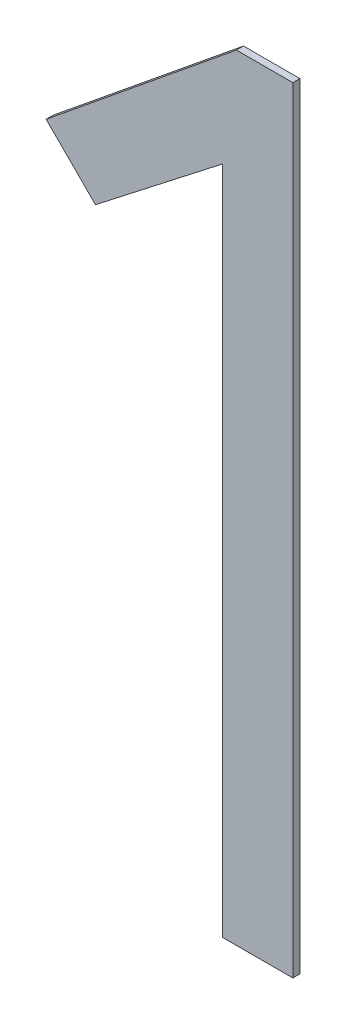
ISO-10303-21;
HEADER;
FILE_DESCRIPTION(('STEP AP214'),'2;1');
FILE_NAME('part.step','',(''),(''),'','','');
FILE_SCHEMA(('AUTOMOTIVE_DESIGN { 1 0 10303 214 1 1 1 1 }'));
ENDSEC;
DATA;
#1=APPLICATION_CONTEXT('core data for automotive mechanical design processes');
#2=APPLICATION_PROTOCOL_DEFINITION('international standard','automotive_design',2000,#1);
#3=PRODUCT_CONTEXT('',#1,'mechanical');
#4=PRODUCT('Part','Part','',(#3));
#5=PRODUCT_RELATED_PRODUCT_CATEGORY('part','',(#4));
#6=PRODUCT_DEFINITION_FORMATION('','',#4);
#7=PRODUCT_DEFINITION_CONTEXT('part definition',#1,'design');
#8=PRODUCT_DEFINITION('design','',#6,#7);
#9=PRODUCT_DEFINITION_SHAPE('','',#8);
#10=(LENGTH_UNIT() NAMED_UNIT(*) SI_UNIT(.MILLI.,.METRE.));
#11=(NAMED_UNIT(*) PLANE_ANGLE_UNIT() SI_UNIT($,.RADIAN.));
#12=(NAMED_UNIT(*) SI_UNIT($,.STERADIAN.) SOLID_ANGLE_UNIT());
#13=UNCERTAINTY_MEASURE_WITH_UNIT(LENGTH_MEASURE(1.E-05),#10,'distance_accuracy_value','');
#14=(GEOMETRIC_REPRESENTATION_CONTEXT(3) GLOBAL_UNCERTAINTY_ASSIGNED_CONTEXT((#13)) GLOBAL_UNIT_ASSIGNED_CONTEXT((#10,
#11,#12)) REPRESENTATION_CONTEXT('',''));
#15=CARTESIAN_POINT('',(0.,0.,0.));
#16=DIRECTION('',(0.,0.,1.));
#17=DIRECTION('',(1.,0.,0.));
#18=AXIS2_PLACEMENT_3D('',#15,#16,#17);
#19=CARTESIAN_POINT('',(-0.17499838,0.33000188,0.01));
#20=DIRECTION('',(0.,0.,1.));
#21=DIRECTION('',(1.,0.,0.));
#22=AXIS2_PLACEMENT_3D('',#19,#20,#21);
#23=PLANE('',#22);
#24=DIRECTION('',(1.,0.,0.));
#25=VECTOR('',#24,1.);
#26=CARTESIAN_POINT('',(0.09500108,0.55000144,0.01));
#27=LINE('',#26,#25);
#28=CARTESIAN_POINT('',(0.09500108,0.55000144,0.01));
#29=VERTEX_POINT('',#28);
#30=CARTESIAN_POINT('',(0.17500092,0.55000144,0.01));
#31=VERTEX_POINT('',#30);
#32=EDGE_CURVE('E107',#29,#31,#27,.T.);
#33=ORIENTED_EDGE('',*,*,#32,.F.);
#34=DIRECTION('',(-0.775234985517289,-0.631672951162236,0.));
#35=VECTOR('',#34,1.);
#36=CARTESIAN_POINT('',(-0.17499838,0.33000188,0.01));
#37=LINE('',#36,#35);
#38=CARTESIAN_POINT('',(-0.17499838,0.33000188,0.01));
#39=VERTEX_POINT('',#38);
#40=EDGE_CURVE('E88',#39,#29,#37,.F.);
#41=ORIENTED_EDGE('',*,*,#40,.F.);
#42=DIRECTION('',(0.707106781186548,-0.707106781186548,0.));
#43=VECTOR('',#42,1.);
#44=CARTESIAN_POINT('',(-0.10499852,0.26000202,0.01));
#45=LINE('',#44,#43);
#46=CARTESIAN_POINT('',(-0.104998519999991,0.260002019999988,0.01));
#47=VERTEX_POINT('',#46);
#48=EDGE_CURVE('E20',#47,#39,#45,.F.);
#49=ORIENTED_EDGE('',*,*,#48,.F.);
#50=DIRECTION('',(0.789352217376165,0.613940613515128,0.));
#51=VECTOR('',#50,1.);
#52=CARTESIAN_POINT('',(0.07500112,0.40000174,0.01));
#53=LINE('',#52,#51);
#54=CARTESIAN_POINT('',(0.07500112,0.40000174,0.01));
#55=VERTEX_POINT('',#54);
#56=EDGE_CURVE('E77',#55,#47,#53,.F.);
#57=ORIENTED_EDGE('',*,*,#56,.F.);
#58=DIRECTION('',(0.,1.,0.));
#59=VECTOR('',#58,1.);
#60=CARTESIAN_POINT('',(0.07500112,-0.5499989,0.01));
#61=LINE('',#60,#59);
#62=CARTESIAN_POINT('',(0.07500112,-0.5499989,0.01));
#63=VERTEX_POINT('',#62);
#64=EDGE_CURVE('E72',#63,#55,#61,.T.);
#65=ORIENTED_EDGE('',*,*,#64,.F.);
#66=DIRECTION('',(1.,0.,0.));
#67=VECTOR('',#66,1.);
#68=CARTESIAN_POINT('',(0.17500092,-0.5499989,0.01));
#69=LINE('',#68,#67);
#70=CARTESIAN_POINT('',(0.17500092,-0.5499989,0.01));
#71=VERTEX_POINT('',#70);
#72=EDGE_CURVE('E99',#71,#63,#69,.F.);
#73=ORIENTED_EDGE('',*,*,#72,.F.);
#74=DIRECTION('',(0.,1.,0.));
#75=VECTOR('',#74,1.);
#76=CARTESIAN_POINT('',(0.17500092,0.55000144,0.01));
#77=LINE('',#76,#75);
#78=EDGE_CURVE('E103',#31,#71,#77,.F.);
#79=ORIENTED_EDGE('',*,*,#78,.F.);
#80=EDGE_LOOP('',(#33,#41,#49,#57,#65,#73,#79));
#81=FACE_BOUND('',#80,.T.);
#82=ADVANCED_FACE('F17',(#81),#23,.T.);
#83=CARTESIAN_POINT('',(-0.10499852,0.26000202,0.));
#84=DIRECTION('',(-0.707106781186548,-0.707106781186548,0.));
#85=DIRECTION('',(0.707106781186548,-0.707106781186548,0.));
#86=AXIS2_PLACEMENT_3D('',#83,#84,#85);
#87=PLANE('',#86);
#88=DIRECTION('',(0.,0.,1.));
#89=VECTOR('',#88,1.);
#90=CARTESIAN_POINT('',(-0.17499838,0.33000188,0.));
#91=LINE('',#90,#89);
#92=CARTESIAN_POINT('',(-0.17499838,0.33000188,0.));
#93=VERTEX_POINT('',#92);
#94=EDGE_CURVE('E111',#93,#39,#91,.T.);
#95=ORIENTED_EDGE('',*,*,#94,.F.);
#96=DIRECTION('',(0.707106781186547,-0.707106781186548,0.));
#97=VECTOR('',#96,1.);
#98=CARTESIAN_POINT('',(-0.17499838,0.33000188,0.));
#99=LINE('',#98,#97);
#100=CARTESIAN_POINT('',(-0.104998519999991,0.260002019999988,0.));
#101=VERTEX_POINT('',#100);
#102=EDGE_CURVE('E94',#93,#101,#99,.T.);
#103=ORIENTED_EDGE('',*,*,#102,.T.);
#104=DIRECTION('',(0.,0.,1.));
#105=VECTOR('',#104,1.);
#106=CARTESIAN_POINT('',(-0.104998519999963,0.260002019999953,0.));
#107=LINE('',#106,#105);
#108=EDGE_CURVE('E82',#47,#101,#107,.F.);
#109=ORIENTED_EDGE('',*,*,#108,.F.);
#110=ORIENTED_EDGE('',*,*,#48,.T.);
#111=EDGE_LOOP('',(#95,#103,#109,#110));
#112=FACE_BOUND('',#111,.T.);
#113=ADVANCED_FACE('F93',(#112),#87,.T.);
#114=CARTESIAN_POINT('',(0.07500112,0.40000174,0.));
#115=DIRECTION('',(0.613940613515128,-0.789352217376165,0.));
#116=DIRECTION('',(0.789352217376165,0.613940613515128,0.));
#117=AXIS2_PLACEMENT_3D('',#114,#115,#116);
#118=PLANE('',#117);
#119=ORIENTED_EDGE('',*,*,#108,.T.);
#120=DIRECTION('',(0.789352217376326,0.613940613514921,0.));
#121=VECTOR('',#120,1.);
#122=CARTESIAN_POINT('',(-0.10499852,0.26000202,0.));
#123=LINE('',#122,#121);
#124=CARTESIAN_POINT('',(0.07500112,0.40000174,0.));
#125=VERTEX_POINT('',#124);
#126=EDGE_CURVE('E116',#101,#125,#123,.T.);
#127=ORIENTED_EDGE('',*,*,#126,.T.);
#128=DIRECTION('',(0.,0.,1.));
#129=VECTOR('',#128,1.);
#130=CARTESIAN_POINT('',(0.07500112,0.40000174,0.));
#131=LINE('',#130,#129);
#132=EDGE_CURVE('E84',#55,#125,#131,.F.);
#133=ORIENTED_EDGE('',*,*,#132,.F.);
#134=ORIENTED_EDGE('',*,*,#56,.T.);
#135=EDGE_LOOP('',(#119,#127,#133,#134));
#136=FACE_BOUND('',#135,.T.);
#137=ADVANCED_FACE('F79',(#136),#118,.T.);
#138=CARTESIAN_POINT('',(0.07500112,-0.5499989,0.));
#139=DIRECTION('',(-1.,0.,0.));
#140=DIRECTION('',(0.,0.,1.));
#141=AXIS2_PLACEMENT_3D('',#138,#139,#140);
#142=PLANE('',#141);
#143=ORIENTED_EDGE('',*,*,#132,.T.);
#144=DIRECTION('',(0.,1.,0.));
#145=VECTOR('',#144,1.);
#146=CARTESIAN_POINT('',(0.07500112,0.33000188,0.));
#147=LINE('',#146,#145);
#148=CARTESIAN_POINT('',(0.07500112,-0.5499989,0.));
#149=VERTEX_POINT('',#148);
#150=EDGE_CURVE('E118',#125,#149,#147,.F.);
#151=ORIENTED_EDGE('',*,*,#150,.T.);
#152=DIRECTION('',(0.,0.,-1.));
#153=VECTOR('',#152,1.);
#154=CARTESIAN_POINT('',(0.07500112,-0.5499989,0.));
#155=LINE('',#154,#153);
#156=EDGE_CURVE('E101',#63,#149,#155,.T.);
#157=ORIENTED_EDGE('',*,*,#156,.F.);
#158=ORIENTED_EDGE('',*,*,#64,.T.);
#159=EDGE_LOOP('',(#143,#151,#157,#158));
#160=FACE_BOUND('',#159,.T.);
#161=ADVANCED_FACE('F144',(#160),#142,.T.);
#162=CARTESIAN_POINT('',(0.17500092,-0.5499989,0.));
#163=DIRECTION('',(0.,-1.,0.));
#164=DIRECTION('',(0.,0.,-1.));
#165=AXIS2_PLACEMENT_3D('',#162,#163,#164);
#166=PLANE('',#165);
#167=ORIENTED_EDGE('',*,*,#156,.T.);
#168=DIRECTION('',(1.,0.,0.));
#169=VECTOR('',#168,1.);
#170=CARTESIAN_POINT('',(-0.17499838,-0.5499989,0.));
#171=LINE('',#170,#169);
#172=CARTESIAN_POINT('',(0.17500092,-0.5499989,0.));
#173=VERTEX_POINT('',#172);
#174=EDGE_CURVE('E121',#149,#173,#171,.T.);
#175=ORIENTED_EDGE('',*,*,#174,.T.);
#176=DIRECTION('',(0.,0.,-1.));
#177=VECTOR('',#176,1.);
#178=CARTESIAN_POINT('',(0.17500092,-0.5499989,0.));
#179=LINE('',#178,#177);
#180=EDGE_CURVE('E105',#71,#173,#179,.T.);
#181=ORIENTED_EDGE('',*,*,#180,.F.);
#182=ORIENTED_EDGE('',*,*,#72,.T.);
#183=EDGE_LOOP('',(#167,#175,#181,#182));
#184=FACE_BOUND('',#183,.T.);
#185=ADVANCED_FACE('F142',(#184),#166,.T.);
#186=CARTESIAN_POINT('',(0.17500092,0.55000144,0.));
#187=DIRECTION('',(1.,0.,0.));
#188=DIRECTION('',(0.,0.,-1.));
#189=AXIS2_PLACEMENT_3D('',#186,#187,#188);
#190=PLANE('',#189);
#191=ORIENTED_EDGE('',*,*,#180,.T.);
#192=DIRECTION('',(0.,1.,0.));
#193=VECTOR('',#192,1.);
#194=CARTESIAN_POINT('',(0.17500092,0.33000188,0.));
#195=LINE('',#194,#193);
#196=CARTESIAN_POINT('',(0.17500092,0.55000144,0.));
#197=VERTEX_POINT('',#196);
#198=EDGE_CURVE('E124',#173,#197,#195,.T.);
#199=ORIENTED_EDGE('',*,*,#198,.T.);
#200=DIRECTION('',(0.,0.,1.));
#201=VECTOR('',#200,1.);
#202=CARTESIAN_POINT('',(0.17500092,0.55000144,0.));
#203=LINE('',#202,#201);
#204=EDGE_CURVE('E109',#31,#197,#203,.F.);
#205=ORIENTED_EDGE('',*,*,#204,.F.);
#206=ORIENTED_EDGE('',*,*,#78,.T.);
#207=EDGE_LOOP('',(#191,#199,#205,#206));
#208=FACE_BOUND('',#207,.T.);
#209=ADVANCED_FACE('F137',(#208),#190,.T.);
#210=CARTESIAN_POINT('',(0.09500108,0.55000144,0.));
#211=DIRECTION('',(0.,1.,0.));
#212=DIRECTION('',(0.,0.,1.));
#213=AXIS2_PLACEMENT_3D('',#210,#211,#212);
#214=PLANE('',#213);
#215=ORIENTED_EDGE('',*,*,#204,.T.);
#216=DIRECTION('',(1.,0.,0.));
#217=VECTOR('',#216,1.);
#218=CARTESIAN_POINT('',(-0.17499838,0.55000144,0.));
#219=LINE('',#218,#217);
#220=CARTESIAN_POINT('',(0.09500108,0.55000144,0.));
#221=VERTEX_POINT('',#220);
#222=EDGE_CURVE('E26',#197,#221,#219,.F.);
#223=ORIENTED_EDGE('',*,*,#222,.T.);
#224=DIRECTION('',(0.,0.,1.));
#225=VECTOR('',#224,1.);
#226=CARTESIAN_POINT('',(0.0950010799999999,0.55000144,0.));
#227=LINE('',#226,#225);
#228=EDGE_CURVE('E34',#29,#221,#227,.F.);
#229=ORIENTED_EDGE('',*,*,#228,.F.);
#230=ORIENTED_EDGE('',*,*,#32,.T.);
#231=EDGE_LOOP('',(#215,#223,#229,#230));
#232=FACE_BOUND('',#231,.T.);
#233=ADVANCED_FACE('F130',(#232),#214,.T.);
#234=CARTESIAN_POINT('',(-0.17499838,0.33000188,0.));
#235=DIRECTION('',(-0.631672951162236,0.775234985517289,0.));
#236=DIRECTION('',(-0.775234985517289,-0.631672951162236,0.));
#237=AXIS2_PLACEMENT_3D('',#234,#235,#236);
#238=PLANE('',#237);
#239=ORIENTED_EDGE('',*,*,#228,.T.);
#240=DIRECTION('',(-0.775234985517289,-0.631672951162235,0.));
#241=VECTOR('',#240,1.);
#242=CARTESIAN_POINT('',(0.09500108,0.55000144,0.));
#243=LINE('',#242,#241);
#244=EDGE_CURVE('E11',#221,#93,#243,.T.);
#245=ORIENTED_EDGE('',*,*,#244,.T.);
#246=ORIENTED_EDGE('',*,*,#94,.T.);
#247=ORIENTED_EDGE('',*,*,#40,.T.);
#248=EDGE_LOOP('',(#239,#245,#246,#247));
#249=FACE_BOUND('',#248,.T.);
#250=ADVANCED_FACE('F155',(#249),#238,.T.);
#251=CARTESIAN_POINT('',(-0.17499838,0.33000188,0.));
#252=DIRECTION('',(0.,0.,1.));
#253=DIRECTION('',(1.,0.,0.));
#254=AXIS2_PLACEMENT_3D('',#251,#252,#253);
#255=PLANE('',#254);
#256=ORIENTED_EDGE('',*,*,#222,.F.);
#257=ORIENTED_EDGE('',*,*,#198,.F.);
#258=ORIENTED_EDGE('',*,*,#174,.F.);
#259=ORIENTED_EDGE('',*,*,#150,.F.);
#260=ORIENTED_EDGE('',*,*,#126,.F.);
#261=ORIENTED_EDGE('',*,*,#102,.F.);
#262=ORIENTED_EDGE('',*,*,#244,.F.);
#263=EDGE_LOOP('',(#256,#257,#258,#259,#260,#261,#262));
#264=FACE_BOUND('',#263,.T.);
#265=ADVANCED_FACE('F134',(#264),#255,.F.);
#266=CLOSED_SHELL('',(#82,#113,#137,#161,#185,#209,#233,#250,#265));
#267=MANIFOLD_SOLID_BREP('B1',#266);
#268=ADVANCED_BREP_SHAPE_REPRESENTATION('',(#18,#267),#14);
#269=SHAPE_DEFINITION_REPRESENTATION(#9,#268);
ENDSEC;
END-ISO-10303-21;
